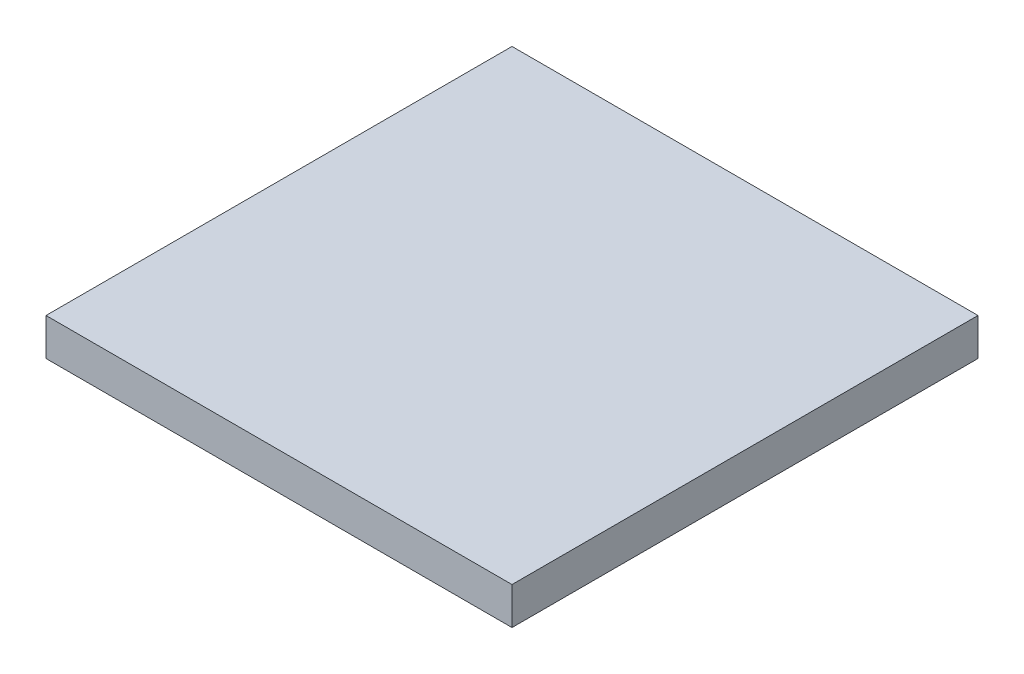
ISO-10303-21;
HEADER;
FILE_DESCRIPTION(('STEP AP214'),'2;1');
FILE_NAME('part.step','',(''),(''),'','','');
FILE_SCHEMA(('AUTOMOTIVE_DESIGN { 1 0 10303 214 1 1 1 1 }'));
ENDSEC;
DATA;
#1=APPLICATION_CONTEXT('core data for automotive mechanical design processes');
#2=APPLICATION_PROTOCOL_DEFINITION('international standard','automotive_design',2000,#1);
#3=PRODUCT_CONTEXT('',#1,'mechanical');
#4=PRODUCT('Part','Part','',(#3));
#5=PRODUCT_RELATED_PRODUCT_CATEGORY('part','',(#4));
#6=PRODUCT_DEFINITION_FORMATION('','',#4);
#7=PRODUCT_DEFINITION_CONTEXT('part definition',#1,'design');
#8=PRODUCT_DEFINITION('design','',#6,#7);
#9=PRODUCT_DEFINITION_SHAPE('','',#8);
#10=(LENGTH_UNIT() NAMED_UNIT(*) SI_UNIT(.MILLI.,.METRE.));
#11=(NAMED_UNIT(*) PLANE_ANGLE_UNIT() SI_UNIT($,.RADIAN.));
#12=(NAMED_UNIT(*) SI_UNIT($,.STERADIAN.) SOLID_ANGLE_UNIT());
#13=UNCERTAINTY_MEASURE_WITH_UNIT(LENGTH_MEASURE(1.E-05),#10,'distance_accuracy_value','');
#14=(GEOMETRIC_REPRESENTATION_CONTEXT(3) GLOBAL_UNCERTAINTY_ASSIGNED_CONTEXT((#13)) GLOBAL_UNIT_ASSIGNED_CONTEXT((#10,
#11,#12)) REPRESENTATION_CONTEXT('',''));
#15=CARTESIAN_POINT('',(0.,0.,0.));
#16=DIRECTION('',(0.,0.,1.));
#17=DIRECTION('',(1.,0.,0.));
#18=AXIS2_PLACEMENT_3D('',#15,#16,#17);
#19=CARTESIAN_POINT('',(0.,2.,0.));
#20=DIRECTION('',(1.,0.,0.));
#21=DIRECTION('',(0.,0.,-1.));
#22=AXIS2_PLACEMENT_3D('',#19,#20,#21);
#23=PLANE('',#22);
#24=DIRECTION('',(0.,0.,1.));
#25=VECTOR('',#24,1.);
#26=CARTESIAN_POINT('',(0.,0.,0.));
#27=LINE('',#26,#25);
#28=CARTESIAN_POINT('',(0.,0.,-25.));
#29=VERTEX_POINT('',#28);
#30=CARTESIAN_POINT('',(0.,0.,0.));
#31=VERTEX_POINT('',#30);
#32=EDGE_CURVE('E96',#29,#31,#27,.T.);
#33=ORIENTED_EDGE('',*,*,#32,.T.);
#34=DIRECTION('',(0.,-1.,0.));
#35=VECTOR('',#34,1.);
#36=CARTESIAN_POINT('',(0.,2.,0.));
#37=LINE('',#36,#35);
#38=CARTESIAN_POINT('',(0.,2.,0.));
#39=VERTEX_POINT('',#38);
#40=EDGE_CURVE('E11',#39,#31,#37,.T.);
#41=ORIENTED_EDGE('',*,*,#40,.F.);
#42=DIRECTION('',(0.,0.,1.));
#43=VECTOR('',#42,1.);
#44=CARTESIAN_POINT('',(0.,2.,0.));
#45=LINE('',#44,#43);
#46=CARTESIAN_POINT('',(0.,2.,-25.));
#47=VERTEX_POINT('',#46);
#48=EDGE_CURVE('E84',#47,#39,#45,.T.);
#49=ORIENTED_EDGE('',*,*,#48,.F.);
#50=DIRECTION('',(0.,-1.,0.));
#51=VECTOR('',#50,1.);
#52=CARTESIAN_POINT('',(0.,2.,-25.));
#53=LINE('',#52,#51);
#54=EDGE_CURVE('E92',#47,#29,#53,.T.);
#55=ORIENTED_EDGE('',*,*,#54,.T.);
#56=EDGE_LOOP('',(#33,#41,#49,#55));
#57=FACE_BOUND('',#56,.T.);
#58=ADVANCED_FACE('F33',(#57),#23,.F.);
#59=CARTESIAN_POINT('',(0.,2.,0.));
#60=DIRECTION('',(0.,0.,-1.));
#61=DIRECTION('',(-1.,0.,0.));
#62=AXIS2_PLACEMENT_3D('',#59,#60,#61);
#63=PLANE('',#62);
#64=DIRECTION('',(1.,0.,0.));
#65=VECTOR('',#64,1.);
#66=CARTESIAN_POINT('',(0.,0.,0.));
#67=LINE('',#66,#65);
#68=CARTESIAN_POINT('',(25.,0.,0.));
#69=VERTEX_POINT('',#68);
#70=EDGE_CURVE('E88',#31,#69,#67,.T.);
#71=ORIENTED_EDGE('',*,*,#70,.T.);
#72=DIRECTION('',(0.,-1.,0.));
#73=VECTOR('',#72,1.);
#74=CARTESIAN_POINT('',(25.,2.,0.));
#75=LINE('',#74,#73);
#76=CARTESIAN_POINT('',(25.,2.,0.));
#77=VERTEX_POINT('',#76);
#78=EDGE_CURVE('E41',#77,#69,#75,.T.);
#79=ORIENTED_EDGE('',*,*,#78,.F.);
#80=DIRECTION('',(1.,0.,0.));
#81=VECTOR('',#80,1.);
#82=CARTESIAN_POINT('',(0.,2.,0.));
#83=LINE('',#82,#81);
#84=EDGE_CURVE('E79',#39,#77,#83,.T.);
#85=ORIENTED_EDGE('',*,*,#84,.F.);
#86=ORIENTED_EDGE('',*,*,#40,.T.);
#87=EDGE_LOOP('',(#71,#79,#85,#86));
#88=FACE_BOUND('',#87,.T.);
#89=ADVANCED_FACE('F87',(#88),#63,.F.);
#90=CARTESIAN_POINT('',(25.,2.,0.));
#91=DIRECTION('',(-1.,0.,0.));
#92=DIRECTION('',(0.,0.,1.));
#93=AXIS2_PLACEMENT_3D('',#90,#91,#92);
#94=PLANE('',#93);
#95=DIRECTION('',(0.,0.,-1.));
#96=VECTOR('',#95,1.);
#97=CARTESIAN_POINT('',(25.,0.,0.));
#98=LINE('',#97,#96);
#99=CARTESIAN_POINT('',(25.,0.,-25.));
#100=VERTEX_POINT('',#99);
#101=EDGE_CURVE('E66',#69,#100,#98,.T.);
#102=ORIENTED_EDGE('',*,*,#101,.T.);
#103=DIRECTION('',(0.,-1.,0.));
#104=VECTOR('',#103,1.);
#105=CARTESIAN_POINT('',(25.,2.,-25.));
#106=LINE('',#105,#104);
#107=CARTESIAN_POINT('',(25.,2.,-25.));
#108=VERTEX_POINT('',#107);
#109=EDGE_CURVE('E89',#108,#100,#106,.T.);
#110=ORIENTED_EDGE('',*,*,#109,.F.);
#111=DIRECTION('',(0.,0.,-1.));
#112=VECTOR('',#111,1.);
#113=CARTESIAN_POINT('',(25.,2.,0.));
#114=LINE('',#113,#112);
#115=EDGE_CURVE('E82',#77,#108,#114,.T.);
#116=ORIENTED_EDGE('',*,*,#115,.F.);
#117=ORIENTED_EDGE('',*,*,#78,.T.);
#118=EDGE_LOOP('',(#102,#110,#116,#117));
#119=FACE_BOUND('',#118,.T.);
#120=ADVANCED_FACE('F90',(#119),#94,.F.);
#121=CARTESIAN_POINT('',(0.,2.,-25.));
#122=DIRECTION('',(0.,0.,1.));
#123=DIRECTION('',(1.,0.,0.));
#124=AXIS2_PLACEMENT_3D('',#121,#122,#123);
#125=PLANE('',#124);
#126=DIRECTION('',(-1.,0.,0.));
#127=VECTOR('',#126,1.);
#128=CARTESIAN_POINT('',(0.,0.,-25.));
#129=LINE('',#128,#127);
#130=EDGE_CURVE('E72',#100,#29,#129,.T.);
#131=ORIENTED_EDGE('',*,*,#130,.T.);
#132=ORIENTED_EDGE('',*,*,#54,.F.);
#133=DIRECTION('',(-1.,0.,0.));
#134=VECTOR('',#133,1.);
#135=CARTESIAN_POINT('',(0.,2.,-25.));
#136=LINE('',#135,#134);
#137=EDGE_CURVE('E49',#108,#47,#136,.T.);
#138=ORIENTED_EDGE('',*,*,#137,.F.);
#139=ORIENTED_EDGE('',*,*,#109,.T.);
#140=EDGE_LOOP('',(#131,#132,#138,#139));
#141=FACE_BOUND('',#140,.T.);
#142=ADVANCED_FACE('F103',(#141),#125,.F.);
#143=CARTESIAN_POINT('',(0.,2.,0.));
#144=DIRECTION('',(0.,-1.,0.));
#145=DIRECTION('',(0.,0.,-1.));
#146=AXIS2_PLACEMENT_3D('',#143,#144,#145);
#147=PLANE('',#146);
#148=ORIENTED_EDGE('',*,*,#48,.T.);
#149=ORIENTED_EDGE('',*,*,#84,.T.);
#150=ORIENTED_EDGE('',*,*,#115,.T.);
#151=ORIENTED_EDGE('',*,*,#137,.T.);
#152=EDGE_LOOP('',(#148,#149,#150,#151));
#153=FACE_BOUND('',#152,.T.);
#154=ADVANCED_FACE('F80',(#153),#147,.F.);
#155=CARTESIAN_POINT('',(0.,0.,0.));
#156=DIRECTION('',(0.,-1.,0.));
#157=DIRECTION('',(0.,0.,-1.));
#158=AXIS2_PLACEMENT_3D('',#155,#156,#157);
#159=PLANE('',#158);
#160=ORIENTED_EDGE('',*,*,#32,.F.);
#161=ORIENTED_EDGE('',*,*,#130,.F.);
#162=ORIENTED_EDGE('',*,*,#101,.F.);
#163=ORIENTED_EDGE('',*,*,#70,.F.);
#164=EDGE_LOOP('',(#160,#161,#162,#163));
#165=FACE_BOUND('',#164,.T.);
#166=ADVANCED_FACE('F106',(#165),#159,.T.);
#167=CLOSED_SHELL('',(#58,#89,#120,#142,#154,#166));
#168=MANIFOLD_SOLID_BREP('B2',#167);
#169=ADVANCED_BREP_SHAPE_REPRESENTATION('',(#18,#168),#14);
#170=SHAPE_DEFINITION_REPRESENTATION(#9,#169);
ENDSEC;
END-ISO-10303-21;
